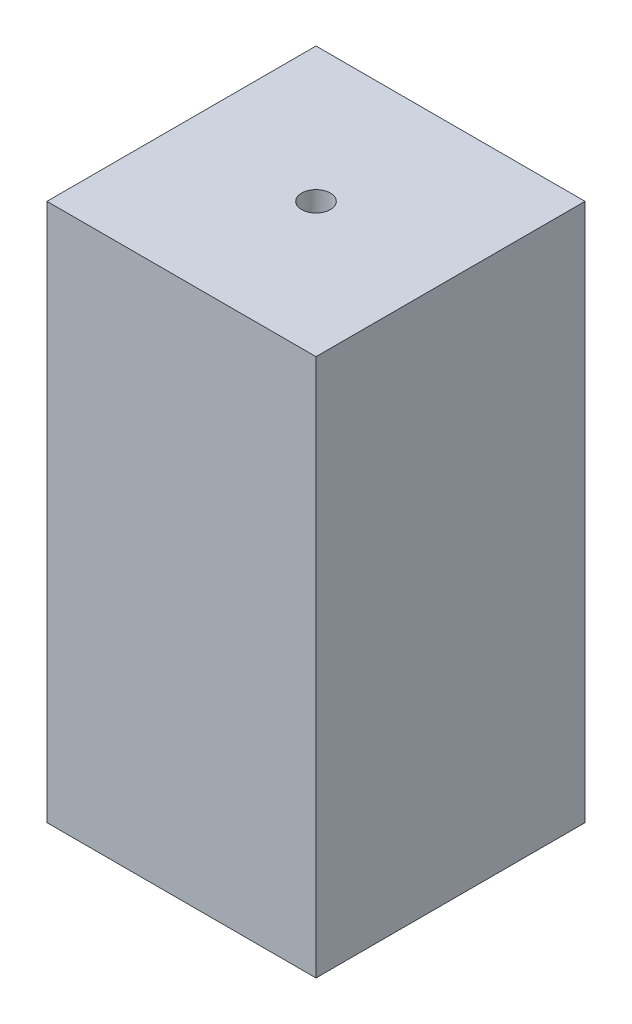
ISO-10303-21;
HEADER;
FILE_DESCRIPTION(('STEP AP214'),'2;1');
FILE_NAME('part.step','',(''),(''),'','','');
FILE_SCHEMA(('AUTOMOTIVE_DESIGN { 1 0 10303 214 1 1 1 1 }'));
ENDSEC;
DATA;
#1=APPLICATION_CONTEXT('core data for automotive mechanical design processes');
#2=APPLICATION_PROTOCOL_DEFINITION('international standard','automotive_design',2000,#1);
#3=PRODUCT_CONTEXT('',#1,'mechanical');
#4=PRODUCT('Part','Part','',(#3));
#5=PRODUCT_RELATED_PRODUCT_CATEGORY('part','',(#4));
#6=PRODUCT_DEFINITION_FORMATION('','',#4);
#7=PRODUCT_DEFINITION_CONTEXT('part definition',#1,'design');
#8=PRODUCT_DEFINITION('design','',#6,#7);
#9=PRODUCT_DEFINITION_SHAPE('','',#8);
#10=(LENGTH_UNIT() NAMED_UNIT(*) SI_UNIT(.MILLI.,.METRE.));
#11=(NAMED_UNIT(*) PLANE_ANGLE_UNIT() SI_UNIT($,.RADIAN.));
#12=(NAMED_UNIT(*) SI_UNIT($,.STERADIAN.) SOLID_ANGLE_UNIT());
#13=UNCERTAINTY_MEASURE_WITH_UNIT(LENGTH_MEASURE(1.E-05),#10,'distance_accuracy_value','');
#14=(GEOMETRIC_REPRESENTATION_CONTEXT(3) GLOBAL_UNCERTAINTY_ASSIGNED_CONTEXT((#13)) GLOBAL_UNIT_ASSIGNED_CONTEXT((#10,
#11,#12)) REPRESENTATION_CONTEXT('',''));
#15=CARTESIAN_POINT('',(0.,0.,0.));
#16=DIRECTION('',(0.,0.,1.));
#17=DIRECTION('',(1.,0.,0.));
#18=AXIS2_PLACEMENT_3D('',#15,#16,#17);
#19=CARTESIAN_POINT('',(37.5,150.,37.5));
#20=DIRECTION('',(-1.,0.,0.));
#21=DIRECTION('',(0.,0.,1.));
#22=AXIS2_PLACEMENT_3D('',#19,#20,#21);
#23=PLANE('',#22);
#24=DIRECTION('',(0.,0.,-1.));
#25=VECTOR('',#24,1.);
#26=CARTESIAN_POINT('',(37.5,0.,37.5));
#27=LINE('',#26,#25);
#28=CARTESIAN_POINT('',(37.5,0.,37.5));
#29=VERTEX_POINT('',#28);
#30=CARTESIAN_POINT('',(37.5,0.,-37.5));
#31=VERTEX_POINT('',#30);
#32=EDGE_CURVE('E102',#29,#31,#27,.T.);
#33=ORIENTED_EDGE('',*,*,#32,.T.);
#34=DIRECTION('',(0.,-1.,0.));
#35=VECTOR('',#34,1.);
#36=CARTESIAN_POINT('',(37.5,150.,-37.5));
#37=LINE('',#36,#35);
#38=CARTESIAN_POINT('',(37.5,150.,-37.5));
#39=VERTEX_POINT('',#38);
#40=EDGE_CURVE('E11',#39,#31,#37,.T.);
#41=ORIENTED_EDGE('',*,*,#40,.F.);
#42=DIRECTION('',(0.,0.,-1.));
#43=VECTOR('',#42,1.);
#44=CARTESIAN_POINT('',(37.5,150.,37.5));
#45=LINE('',#44,#43);
#46=CARTESIAN_POINT('',(37.5,150.,37.5));
#47=VERTEX_POINT('',#46);
#48=EDGE_CURVE('E90',#47,#39,#45,.T.);
#49=ORIENTED_EDGE('',*,*,#48,.F.);
#50=DIRECTION('',(0.,-1.,0.));
#51=VECTOR('',#50,1.);
#52=CARTESIAN_POINT('',(37.5,150.,37.5));
#53=LINE('',#52,#51);
#54=EDGE_CURVE('E98',#47,#29,#53,.T.);
#55=ORIENTED_EDGE('',*,*,#54,.T.);
#56=EDGE_LOOP('',(#33,#41,#49,#55));
#57=FACE_BOUND('',#56,.T.);
#58=ADVANCED_FACE('F39',(#57),#23,.F.);
#59=CARTESIAN_POINT('',(-37.5,150.,-37.5));
#60=DIRECTION('',(0.,0.,1.));
#61=DIRECTION('',(1.,0.,0.));
#62=AXIS2_PLACEMENT_3D('',#59,#60,#61);
#63=PLANE('',#62);
#64=DIRECTION('',(-1.,0.,0.));
#65=VECTOR('',#64,1.);
#66=CARTESIAN_POINT('',(-37.5,0.,-37.5));
#67=LINE('',#66,#65);
#68=CARTESIAN_POINT('',(-37.5,0.,-37.5));
#69=VERTEX_POINT('',#68);
#70=EDGE_CURVE('E94',#31,#69,#67,.T.);
#71=ORIENTED_EDGE('',*,*,#70,.T.);
#72=DIRECTION('',(0.,-1.,0.));
#73=VECTOR('',#72,1.);
#74=CARTESIAN_POINT('',(-37.5,150.,-37.5));
#75=LINE('',#74,#73);
#76=CARTESIAN_POINT('',(-37.5,150.,-37.5));
#77=VERTEX_POINT('',#76);
#78=EDGE_CURVE('E47',#77,#69,#75,.T.);
#79=ORIENTED_EDGE('',*,*,#78,.F.);
#80=DIRECTION('',(-1.,0.,0.));
#81=VECTOR('',#80,1.);
#82=CARTESIAN_POINT('',(-37.5,150.,-37.5));
#83=LINE('',#82,#81);
#84=EDGE_CURVE('E85',#39,#77,#83,.T.);
#85=ORIENTED_EDGE('',*,*,#84,.F.);
#86=ORIENTED_EDGE('',*,*,#40,.T.);
#87=EDGE_LOOP('',(#71,#79,#85,#86));
#88=FACE_BOUND('',#87,.T.);
#89=ADVANCED_FACE('F93',(#88),#63,.F.);
#90=CARTESIAN_POINT('',(-37.5,150.,37.5));
#91=DIRECTION('',(1.,0.,0.));
#92=DIRECTION('',(0.,0.,-1.));
#93=AXIS2_PLACEMENT_3D('',#90,#91,#92);
#94=PLANE('',#93);
#95=DIRECTION('',(0.,0.,1.));
#96=VECTOR('',#95,1.);
#97=CARTESIAN_POINT('',(-37.5,0.,37.5));
#98=LINE('',#97,#96);
#99=CARTESIAN_POINT('',(-37.5,0.,37.5));
#100=VERTEX_POINT('',#99);
#101=EDGE_CURVE('E72',#69,#100,#98,.T.);
#102=ORIENTED_EDGE('',*,*,#101,.T.);
#103=DIRECTION('',(0.,-1.,0.));
#104=VECTOR('',#103,1.);
#105=CARTESIAN_POINT('',(-37.5,150.,37.5));
#106=LINE('',#105,#104);
#107=CARTESIAN_POINT('',(-37.5,150.,37.5));
#108=VERTEX_POINT('',#107);
#109=EDGE_CURVE('E95',#108,#100,#106,.T.);
#110=ORIENTED_EDGE('',*,*,#109,.F.);
#111=DIRECTION('',(0.,0.,1.));
#112=VECTOR('',#111,1.);
#113=CARTESIAN_POINT('',(-37.5,150.,37.5));
#114=LINE('',#113,#112);
#115=EDGE_CURVE('E88',#77,#108,#114,.T.);
#116=ORIENTED_EDGE('',*,*,#115,.F.);
#117=ORIENTED_EDGE('',*,*,#78,.T.);
#118=EDGE_LOOP('',(#102,#110,#116,#117));
#119=FACE_BOUND('',#118,.T.);
#120=ADVANCED_FACE('F96',(#119),#94,.F.);
#121=CARTESIAN_POINT('',(-37.5,150.,37.5));
#122=DIRECTION('',(0.,0.,-1.));
#123=DIRECTION('',(-1.,0.,0.));
#124=AXIS2_PLACEMENT_3D('',#121,#122,#123);
#125=PLANE('',#124);
#126=DIRECTION('',(1.,0.,0.));
#127=VECTOR('',#126,1.);
#128=CARTESIAN_POINT('',(-37.5,0.,37.5));
#129=LINE('',#128,#127);
#130=EDGE_CURVE('E78',#100,#29,#129,.T.);
#131=ORIENTED_EDGE('',*,*,#130,.T.);
#132=ORIENTED_EDGE('',*,*,#54,.F.);
#133=DIRECTION('',(1.,0.,0.));
#134=VECTOR('',#133,1.);
#135=CARTESIAN_POINT('',(-37.5,150.,37.5));
#136=LINE('',#135,#134);
#137=EDGE_CURVE('E55',#108,#47,#136,.T.);
#138=ORIENTED_EDGE('',*,*,#137,.F.);
#139=ORIENTED_EDGE('',*,*,#109,.T.);
#140=EDGE_LOOP('',(#131,#132,#138,#139));
#141=FACE_BOUND('',#140,.T.);
#142=ADVANCED_FACE('F110',(#141),#125,.F.);
#143=CARTESIAN_POINT('',(0.,150.,0.));
#144=DIRECTION('',(0.,-1.,0.));
#145=DIRECTION('',(0.,0.,-1.));
#146=AXIS2_PLACEMENT_3D('',#143,#144,#145);
#147=PLANE('',#146);
#148=CARTESIAN_POINT('',(0.,150.,0.));
#149=DIRECTION('',(0.,1.,0.));
#150=DIRECTION('',(0.,0.,1.));
#151=AXIS2_PLACEMENT_3D('',#148,#149,#150);
#152=CIRCLE('',#151,4.);
#153=CARTESIAN_POINT('',(0.,150.,4.));
#154=VERTEX_POINT('',#153);
#155=EDGE_CURVE('E122',#154,#154,#152,.T.);
#156=ORIENTED_EDGE('',*,*,#155,.F.);
#157=EDGE_LOOP('',(#156));
#158=FACE_BOUND('',#157,.T.);
#159=ORIENTED_EDGE('',*,*,#48,.T.);
#160=ORIENTED_EDGE('',*,*,#84,.T.);
#161=ORIENTED_EDGE('',*,*,#115,.T.);
#162=ORIENTED_EDGE('',*,*,#137,.T.);
#163=EDGE_LOOP('',(#159,#160,#161,#162));
#164=FACE_BOUND('',#163,.T.);
#165=ADVANCED_FACE('F86',(#158,#164),#147,.F.);
#166=CARTESIAN_POINT('',(0.,0.,0.));
#167=DIRECTION('',(0.,-1.,0.));
#168=DIRECTION('',(0.,0.,-1.));
#169=AXIS2_PLACEMENT_3D('',#166,#167,#168);
#170=PLANE('',#169);
#171=CARTESIAN_POINT('',(0.,0.,0.));
#172=DIRECTION('',(0.,1.,0.));
#173=DIRECTION('',(0.,0.,1.));
#174=AXIS2_PLACEMENT_3D('',#171,#172,#173);
#175=CIRCLE('',#174,4.);
#176=CARTESIAN_POINT('',(0.,0.,4.));
#177=VERTEX_POINT('',#176);
#178=EDGE_CURVE('E116',#177,#177,#175,.T.);
#179=ORIENTED_EDGE('',*,*,#178,.T.);
#180=EDGE_LOOP('',(#179));
#181=FACE_BOUND('',#180,.T.);
#182=ORIENTED_EDGE('',*,*,#32,.F.);
#183=ORIENTED_EDGE('',*,*,#130,.F.);
#184=ORIENTED_EDGE('',*,*,#101,.F.);
#185=ORIENTED_EDGE('',*,*,#70,.F.);
#186=EDGE_LOOP('',(#182,#183,#184,#185));
#187=FACE_BOUND('',#186,.T.);
#188=ADVANCED_FACE('F113',(#181,#187),#170,.T.);
#189=CARTESIAN_POINT('',(0.,14.,0.));
#190=DIRECTION('',(0.,-1.,0.));
#191=DIRECTION('',(0.,0.,-1.));
#192=AXIS2_PLACEMENT_3D('',#189,#190,#191);
#193=CYLINDRICAL_SURFACE('',#192,4.);
#194=CARTESIAN_POINT('',(0.,14.,0.));
#195=DIRECTION('',(0.,1.,0.));
#196=DIRECTION('',(0.,0.,1.));
#197=AXIS2_PLACEMENT_3D('',#194,#195,#196);
#198=CIRCLE('',#197,4.);
#199=CARTESIAN_POINT('',(0.,14.,4.));
#200=VERTEX_POINT('',#199);
#201=EDGE_CURVE('E105',#200,#200,#198,.T.);
#202=ORIENTED_EDGE('',*,*,#201,.T.);
#203=EDGE_LOOP('',(#202));
#204=FACE_BOUND('',#203,.T.);
#205=ORIENTED_EDGE('',*,*,#178,.F.);
#206=EDGE_LOOP('',(#205));
#207=FACE_BOUND('',#206,.T.);
#208=ADVANCED_FACE('F143',(#204,#207),#193,.F.);
#209=CARTESIAN_POINT('',(0.,14.,0.));
#210=DIRECTION('',(0.,1.,0.));
#211=DIRECTION('',(0.,0.,1.));
#212=AXIS2_PLACEMENT_3D('',#209,#210,#211);
#213=PLANE('',#212);
#214=ORIENTED_EDGE('',*,*,#201,.F.);
#215=EDGE_LOOP('',(#214));
#216=FACE_BOUND('',#215,.T.);
#217=ADVANCED_FACE('F133',(#216),#213,.F.);
#218=CARTESIAN_POINT('',(0.,136.,0.));
#219=DIRECTION('',(0.,1.,0.));
#220=DIRECTION('',(0.,0.,1.));
#221=AXIS2_PLACEMENT_3D('',#218,#219,#220);
#222=CYLINDRICAL_SURFACE('',#221,4.);
#223=CARTESIAN_POINT('',(0.,136.,0.));
#224=DIRECTION('',(0.,1.,0.));
#225=DIRECTION('',(0.,0.,1.));
#226=AXIS2_PLACEMENT_3D('',#223,#224,#225);
#227=CIRCLE('',#226,4.);
#228=CARTESIAN_POINT('',(0.,136.,4.));
#229=VERTEX_POINT('',#228);
#230=EDGE_CURVE('E119',#229,#229,#227,.T.);
#231=ORIENTED_EDGE('',*,*,#230,.F.);
#232=EDGE_LOOP('',(#231));
#233=FACE_BOUND('',#232,.T.);
#234=ORIENTED_EDGE('',*,*,#155,.T.);
#235=EDGE_LOOP('',(#234));
#236=FACE_BOUND('',#235,.T.);
#237=ADVANCED_FACE('F130',(#233,#236),#222,.F.);
#238=CARTESIAN_POINT('',(0.,136.,0.));
#239=DIRECTION('',(0.,1.,0.));
#240=DIRECTION('',(0.,0.,1.));
#241=AXIS2_PLACEMENT_3D('',#238,#239,#240);
#242=PLANE('',#241);
#243=ORIENTED_EDGE('',*,*,#230,.T.);
#244=EDGE_LOOP('',(#243));
#245=FACE_BOUND('',#244,.T.);
#246=ADVANCED_FACE('F128',(#245),#242,.T.);
#247=CLOSED_SHELL('',(#58,#89,#120,#142,#165,#188,#208,#217,#237,#246));
#248=MANIFOLD_SOLID_BREP('B2',#247);
#249=ADVANCED_BREP_SHAPE_REPRESENTATION('',(#18,#248),#14);
#250=SHAPE_DEFINITION_REPRESENTATION(#9,#249);
ENDSEC;
END-ISO-10303-21;
